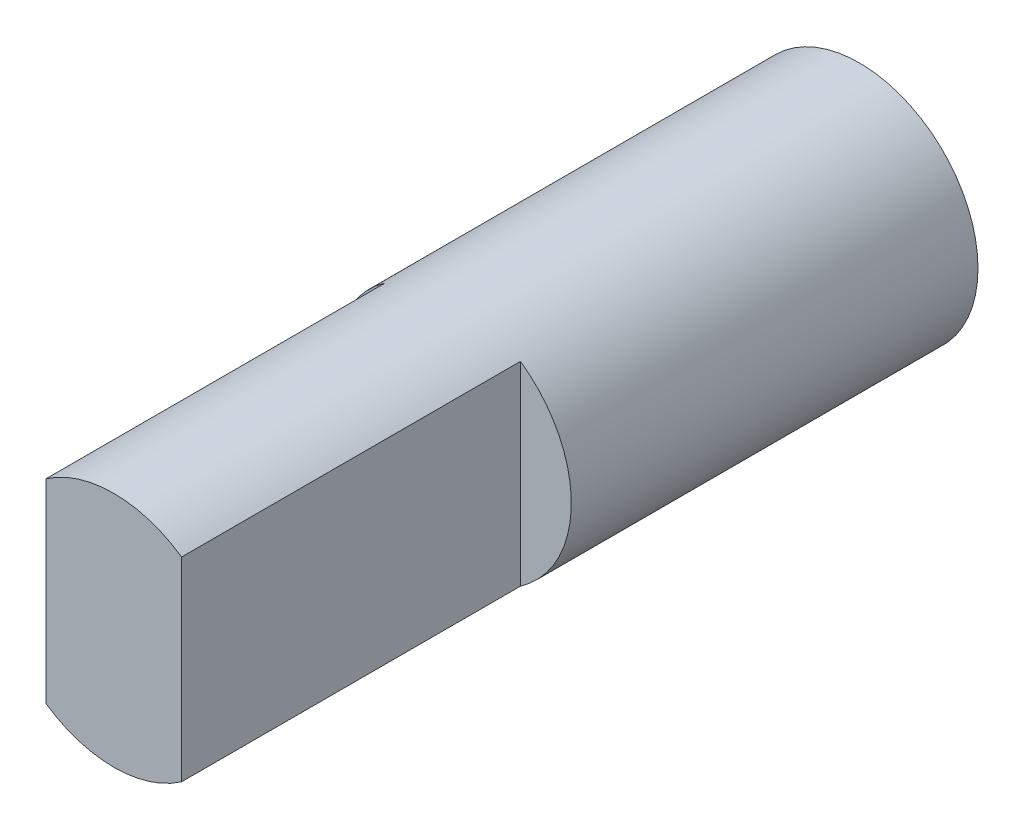
ISO-10303-21;
HEADER;
FILE_DESCRIPTION(('STEP AP214'),'2;1');
FILE_NAME('part.step','',(''),(''),'','','');
FILE_SCHEMA(('AUTOMOTIVE_DESIGN { 1 0 10303 214 1 1 1 1 }'));
ENDSEC;
DATA;
#1=APPLICATION_CONTEXT('core data for automotive mechanical design processes');
#2=APPLICATION_PROTOCOL_DEFINITION('international standard','automotive_design',2000,#1);
#3=PRODUCT_CONTEXT('',#1,'mechanical');
#4=PRODUCT('Part','Part','',(#3));
#5=PRODUCT_RELATED_PRODUCT_CATEGORY('part','',(#4));
#6=PRODUCT_DEFINITION_FORMATION('','',#4);
#7=PRODUCT_DEFINITION_CONTEXT('part definition',#1,'design');
#8=PRODUCT_DEFINITION('design','',#6,#7);
#9=PRODUCT_DEFINITION_SHAPE('','',#8);
#10=(LENGTH_UNIT() NAMED_UNIT(*) SI_UNIT(.MILLI.,.METRE.));
#11=(NAMED_UNIT(*) PLANE_ANGLE_UNIT() SI_UNIT($,.RADIAN.));
#12=(NAMED_UNIT(*) SI_UNIT($,.STERADIAN.) SOLID_ANGLE_UNIT());
#13=UNCERTAINTY_MEASURE_WITH_UNIT(LENGTH_MEASURE(1.E-05),#10,'distance_accuracy_value','');
#14=(GEOMETRIC_REPRESENTATION_CONTEXT(3) GLOBAL_UNCERTAINTY_ASSIGNED_CONTEXT((#13)) GLOBAL_UNIT_ASSIGNED_CONTEXT((#10,
#11,#12)) REPRESENTATION_CONTEXT('',''));
#15=CARTESIAN_POINT('',(0.,0.,0.));
#16=DIRECTION('',(0.,0.,1.));
#17=DIRECTION('',(1.,0.,0.));
#18=AXIS2_PLACEMENT_3D('',#15,#16,#17);
#19=CARTESIAN_POINT('',(0.,0.,11.));
#20=DIRECTION('',(0.,0.,-1.));
#21=DIRECTION('',(-1.,0.,0.));
#22=AXIS2_PLACEMENT_3D('',#19,#20,#21);
#23=CYLINDRICAL_SURFACE('',#22,1.75);
#24=CARTESIAN_POINT('',(0.,0.,0.));
#25=DIRECTION('',(0.,0.,1.));
#26=DIRECTION('',(1.,0.,0.));
#27=AXIS2_PLACEMENT_3D('',#24,#25,#26);
#28=CIRCLE('',#27,1.75);
#29=CARTESIAN_POINT('',(1.75,0.,0.));
#30=VERTEX_POINT('',#29);
#31=EDGE_CURVE('E90',#30,#30,#28,.T.);
#32=ORIENTED_EDGE('',*,*,#31,.T.);
#33=EDGE_LOOP('',(#32));
#34=FACE_BOUND('',#33,.T.);
#35=DIRECTION('',(0.,0.,-1.));
#36=VECTOR('',#35,1.);
#37=CARTESIAN_POINT('',(-0.999999999999999,1.43614066163451,11.));
#38=LINE('',#37,#36);
#39=CARTESIAN_POINT('',(-0.999999999999999,1.43614066163451,11.));
#40=VERTEX_POINT('',#39);
#41=CARTESIAN_POINT('',(-0.999999999999999,1.43614066163451,6.));
#42=VERTEX_POINT('',#41);
#43=EDGE_CURVE('E74',#40,#42,#38,.T.);
#44=ORIENTED_EDGE('',*,*,#43,.F.);
#45=CARTESIAN_POINT('',(0.,0.,11.));
#46=DIRECTION('',(0.,0.,1.));
#47=DIRECTION('',(1.,0.,0.));
#48=AXIS2_PLACEMENT_3D('',#45,#46,#47);
#49=CIRCLE('',#48,1.75);
#50=CARTESIAN_POINT('',(1.,1.43614066163451,11.));
#51=VERTEX_POINT('',#50);
#52=EDGE_CURVE('E82',#51,#40,#49,.T.);
#53=ORIENTED_EDGE('',*,*,#52,.F.);
#54=DIRECTION('',(0.,0.,-1.));
#55=VECTOR('',#54,1.);
#56=CARTESIAN_POINT('',(1.,1.43614066163451,11.));
#57=LINE('',#56,#55);
#58=CARTESIAN_POINT('',(1.,1.43614066163451,6.));
#59=VERTEX_POINT('',#58);
#60=EDGE_CURVE('E54',#59,#51,#57,.F.);
#61=ORIENTED_EDGE('',*,*,#60,.F.);
#62=CARTESIAN_POINT('',(0.,0.,6.));
#63=DIRECTION('',(0.,0.,1.));
#64=DIRECTION('',(1.,0.,0.));
#65=AXIS2_PLACEMENT_3D('',#62,#63,#64);
#66=CIRCLE('',#65,1.75);
#67=CARTESIAN_POINT('',(1.,-1.43614066163451,6.));
#68=VERTEX_POINT('',#67);
#69=EDGE_CURVE('E79',#68,#59,#66,.T.);
#70=ORIENTED_EDGE('',*,*,#69,.F.);
#71=DIRECTION('',(0.,0.,-1.));
#72=VECTOR('',#71,1.);
#73=CARTESIAN_POINT('',(1.,-1.43614066163451,11.));
#74=LINE('',#73,#72);
#75=CARTESIAN_POINT('',(1.,-1.43614066163451,11.));
#76=VERTEX_POINT('',#75);
#77=EDGE_CURVE('E93',#76,#68,#74,.T.);
#78=ORIENTED_EDGE('',*,*,#77,.F.);
#79=CARTESIAN_POINT('',(-0.999999999999999,-1.43614066163451,11.));
#80=VERTEX_POINT('',#79);
#81=EDGE_CURVE('E87',#80,#76,#49,.T.);
#82=ORIENTED_EDGE('',*,*,#81,.F.);
#83=DIRECTION('',(0.,0.,-1.));
#84=VECTOR('',#83,1.);
#85=CARTESIAN_POINT('',(-0.999999999999999,-1.43614066163451,11.));
#86=LINE('',#85,#84);
#87=CARTESIAN_POINT('',(-0.999999999999999,-1.43614066163451,6.));
#88=VERTEX_POINT('',#87);
#89=EDGE_CURVE('E46',#88,#80,#86,.F.);
#90=ORIENTED_EDGE('',*,*,#89,.F.);
#91=CARTESIAN_POINT('',(0.,0.,6.));
#92=DIRECTION('',(0.,0.,1.));
#93=DIRECTION('',(1.,0.,0.));
#94=AXIS2_PLACEMENT_3D('',#91,#92,#93);
#95=CIRCLE('',#94,1.75);
#96=EDGE_CURVE('E11',#42,#88,#95,.T.);
#97=ORIENTED_EDGE('',*,*,#96,.F.);
#98=EDGE_LOOP('',(#44,#53,#61,#70,#78,#82,#90,#97));
#99=FACE_BOUND('',#98,.T.);
#100=ADVANCED_FACE('F32',(#34,#99),#23,.T.);
#101=CARTESIAN_POINT('',(0.,0.,11.));
#102=DIRECTION('',(0.,0.,1.));
#103=DIRECTION('',(1.,0.,0.));
#104=AXIS2_PLACEMENT_3D('',#101,#102,#103);
#105=PLANE('',#104);
#106=ORIENTED_EDGE('',*,*,#52,.T.);
#107=DIRECTION('',(0.,-1.,0.));
#108=VECTOR('',#107,1.);
#109=CARTESIAN_POINT('',(-0.999999999999999,0.,11.));
#110=LINE('',#109,#108);
#111=EDGE_CURVE('E39',#40,#80,#110,.T.);
#112=ORIENTED_EDGE('',*,*,#111,.T.);
#113=ORIENTED_EDGE('',*,*,#81,.T.);
#114=DIRECTION('',(0.,1.,0.));
#115=VECTOR('',#114,1.);
#116=CARTESIAN_POINT('',(1.,0.,11.));
#117=LINE('',#116,#115);
#118=EDGE_CURVE('E86',#76,#51,#117,.T.);
#119=ORIENTED_EDGE('',*,*,#118,.T.);
#120=EDGE_LOOP('',(#106,#112,#113,#119));
#121=FACE_BOUND('',#120,.T.);
#122=ADVANCED_FACE('F85',(#121),#105,.T.);
#123=CARTESIAN_POINT('',(0.,0.,0.));
#124=DIRECTION('',(0.,0.,1.));
#125=DIRECTION('',(1.,0.,0.));
#126=AXIS2_PLACEMENT_3D('',#123,#124,#125);
#127=PLANE('',#126);
#128=ORIENTED_EDGE('',*,*,#31,.F.);
#129=EDGE_LOOP('',(#128));
#130=FACE_BOUND('',#129,.T.);
#131=ADVANCED_FACE('F122',(#130),#127,.F.);
#132=CARTESIAN_POINT('',(1.,1.75,6.));
#133=DIRECTION('',(0.,0.,1.));
#134=DIRECTION('',(1.,0.,0.));
#135=AXIS2_PLACEMENT_3D('',#132,#133,#134);
#136=PLANE('',#135);
#137=ORIENTED_EDGE('',*,*,#69,.T.);
#138=DIRECTION('',(0.,-1.,0.));
#139=VECTOR('',#138,1.);
#140=CARTESIAN_POINT('',(1.,1.75,6.));
#141=LINE('',#140,#139);
#142=EDGE_CURVE('E83',#59,#68,#141,.T.);
#143=ORIENTED_EDGE('',*,*,#142,.T.);
#144=EDGE_LOOP('',(#137,#143));
#145=FACE_BOUND('',#144,.T.);
#146=ADVANCED_FACE('F100',(#145),#136,.T.);
#147=CARTESIAN_POINT('',(1.,1.75,6.));
#148=DIRECTION('',(1.,0.,0.));
#149=DIRECTION('',(0.,0.,-1.));
#150=AXIS2_PLACEMENT_3D('',#147,#148,#149);
#151=PLANE('',#150);
#152=ORIENTED_EDGE('',*,*,#77,.T.);
#153=ORIENTED_EDGE('',*,*,#142,.F.);
#154=ORIENTED_EDGE('',*,*,#60,.T.);
#155=ORIENTED_EDGE('',*,*,#118,.F.);
#156=EDGE_LOOP('',(#152,#153,#154,#155));
#157=FACE_BOUND('',#156,.T.);
#158=ADVANCED_FACE('F102',(#157),#151,.T.);
#159=CARTESIAN_POINT('',(-0.999999999999999,1.75,6.));
#160=DIRECTION('',(0.,0.,1.));
#161=DIRECTION('',(1.,0.,0.));
#162=AXIS2_PLACEMENT_3D('',#159,#160,#161);
#163=PLANE('',#162);
#164=DIRECTION('',(0.,-1.,0.));
#165=VECTOR('',#164,1.);
#166=CARTESIAN_POINT('',(-0.999999999999999,1.75,6.));
#167=LINE('',#166,#165);
#168=EDGE_CURVE('E106',#42,#88,#167,.T.);
#169=ORIENTED_EDGE('',*,*,#168,.F.);
#170=ORIENTED_EDGE('',*,*,#96,.T.);
#171=EDGE_LOOP('',(#169,#170));
#172=FACE_BOUND('',#171,.T.);
#173=ADVANCED_FACE('F108',(#172),#163,.T.);
#174=CARTESIAN_POINT('',(-0.999999999999999,1.75,6.));
#175=DIRECTION('',(-1.,0.,0.));
#176=DIRECTION('',(0.,0.,1.));
#177=AXIS2_PLACEMENT_3D('',#174,#175,#176);
#178=PLANE('',#177);
#179=ORIENTED_EDGE('',*,*,#43,.T.);
#180=ORIENTED_EDGE('',*,*,#168,.T.);
#181=ORIENTED_EDGE('',*,*,#89,.T.);
#182=ORIENTED_EDGE('',*,*,#111,.F.);
#183=EDGE_LOOP('',(#179,#180,#181,#182));
#184=FACE_BOUND('',#183,.T.);
#185=ADVANCED_FACE('F73',(#184),#178,.T.);
#186=CLOSED_SHELL('',(#100,#122,#131,#146,#158,#173,#185));
#187=MANIFOLD_SOLID_BREP('B2',#186);
#188=ADVANCED_BREP_SHAPE_REPRESENTATION('',(#18,#187),#14);
#189=SHAPE_DEFINITION_REPRESENTATION(#9,#188);
ENDSEC;
END-ISO-10303-21;
